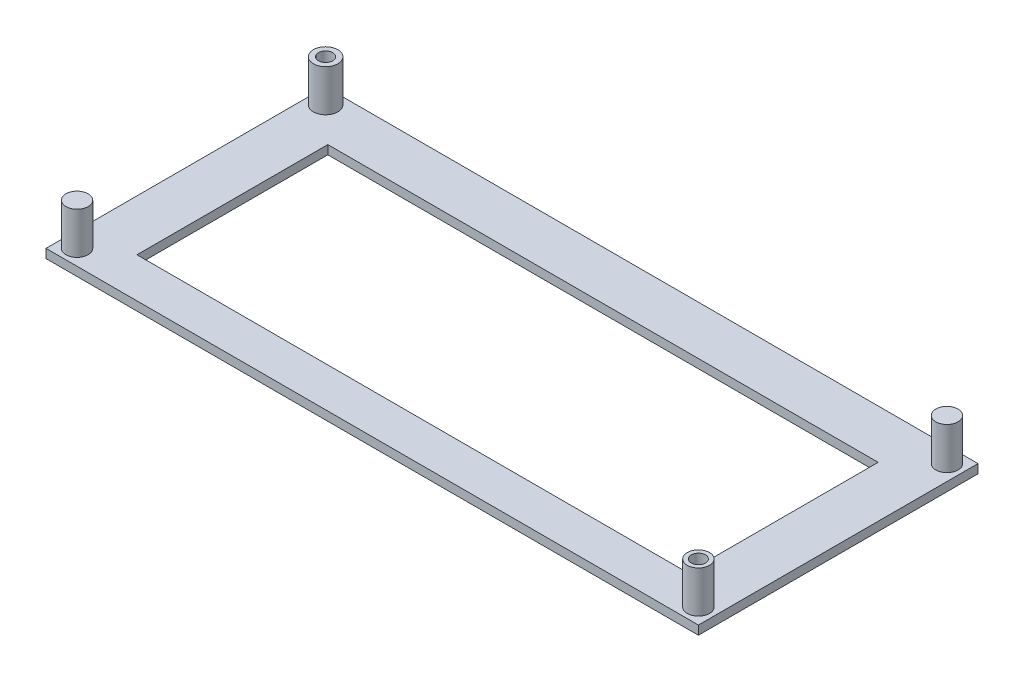
ISO-10303-21;
HEADER;
FILE_DESCRIPTION(('STEP AP214'),'2;1');
FILE_NAME('part.step','',(''),(''),'','','');
FILE_SCHEMA(('AUTOMOTIVE_DESIGN { 1 0 10303 214 1 1 1 1 }'));
ENDSEC;
DATA;
#1=APPLICATION_CONTEXT('core data for automotive mechanical design processes');
#2=APPLICATION_PROTOCOL_DEFINITION('international standard','automotive_design',2000,#1);
#3=PRODUCT_CONTEXT('',#1,'mechanical');
#4=PRODUCT('Part','Part','',(#3));
#5=PRODUCT_RELATED_PRODUCT_CATEGORY('part','',(#4));
#6=PRODUCT_DEFINITION_FORMATION('','',#4);
#7=PRODUCT_DEFINITION_CONTEXT('part definition',#1,'design');
#8=PRODUCT_DEFINITION('design','',#6,#7);
#9=PRODUCT_DEFINITION_SHAPE('','',#8);
#10=(LENGTH_UNIT() NAMED_UNIT(*) SI_UNIT(.MILLI.,.METRE.));
#11=(NAMED_UNIT(*) PLANE_ANGLE_UNIT() SI_UNIT($,.RADIAN.));
#12=(NAMED_UNIT(*) SI_UNIT($,.STERADIAN.) SOLID_ANGLE_UNIT());
#13=UNCERTAINTY_MEASURE_WITH_UNIT(LENGTH_MEASURE(1.E-05),#10,'distance_accuracy_value','');
#14=(GEOMETRIC_REPRESENTATION_CONTEXT(3) GLOBAL_UNCERTAINTY_ASSIGNED_CONTEXT((#13)) GLOBAL_UNIT_ASSIGNED_CONTEXT((#10,
#11,#12)) REPRESENTATION_CONTEXT('',''));
#15=CARTESIAN_POINT('',(0.,0.,0.));
#16=DIRECTION('',(0.,0.,1.));
#17=DIRECTION('',(1.,0.,0.));
#18=AXIS2_PLACEMENT_3D('',#15,#16,#17);
#19=CARTESIAN_POINT('',(0.,2.,-63.));
#20=DIRECTION('',(1.,0.,0.));
#21=DIRECTION('',(0.,0.,-1.));
#22=AXIS2_PLACEMENT_3D('',#19,#20,#21);
#23=PLANE('',#22);
#24=DIRECTION('',(0.,0.,1.));
#25=VECTOR('',#24,1.);
#26=CARTESIAN_POINT('',(0.,0.,-63.));
#27=LINE('',#26,#25);
#28=CARTESIAN_POINT('',(0.,0.,-63.));
#29=VERTEX_POINT('',#28);
#30=CARTESIAN_POINT('',(0.,0.,0.));
#31=VERTEX_POINT('',#30);
#32=EDGE_CURVE('E134',#29,#31,#27,.T.);
#33=ORIENTED_EDGE('',*,*,#32,.T.);
#34=DIRECTION('',(0.,-1.,0.));
#35=VECTOR('',#34,1.);
#36=CARTESIAN_POINT('',(0.,2.,0.));
#37=LINE('',#36,#35);
#38=CARTESIAN_POINT('',(0.,2.,0.));
#39=VERTEX_POINT('',#38);
#40=EDGE_CURVE('E11',#39,#31,#37,.T.);
#41=ORIENTED_EDGE('',*,*,#40,.F.);
#42=DIRECTION('',(0.,0.,1.));
#43=VECTOR('',#42,1.);
#44=CARTESIAN_POINT('',(0.,2.,-63.));
#45=LINE('',#44,#43);
#46=CARTESIAN_POINT('',(0.,2.,-63.));
#47=VERTEX_POINT('',#46);
#48=EDGE_CURVE('E138',#47,#39,#45,.T.);
#49=ORIENTED_EDGE('',*,*,#48,.F.);
#50=DIRECTION('',(0.,-1.,0.));
#51=VECTOR('',#50,1.);
#52=CARTESIAN_POINT('',(0.,2.,-63.));
#53=LINE('',#52,#51);
#54=EDGE_CURVE('E148',#47,#29,#53,.T.);
#55=ORIENTED_EDGE('',*,*,#54,.T.);
#56=EDGE_LOOP('',(#33,#41,#49,#55));
#57=FACE_BOUND('',#56,.T.);
#58=ADVANCED_FACE('F33',(#57),#23,.F.);
#59=CARTESIAN_POINT('',(0.,2.,0.));
#60=DIRECTION('',(0.,0.,-1.));
#61=DIRECTION('',(-1.,0.,0.));
#62=AXIS2_PLACEMENT_3D('',#59,#60,#61);
#63=PLANE('',#62);
#64=DIRECTION('',(1.,0.,0.));
#65=VECTOR('',#64,1.);
#66=CARTESIAN_POINT('',(0.,0.,0.));
#67=LINE('',#66,#65);
#68=CARTESIAN_POINT('',(147.,0.,0.));
#69=VERTEX_POINT('',#68);
#70=EDGE_CURVE('E151',#31,#69,#67,.T.);
#71=ORIENTED_EDGE('',*,*,#70,.T.);
#72=DIRECTION('',(0.,-1.,0.));
#73=VECTOR('',#72,1.);
#74=CARTESIAN_POINT('',(147.,2.,0.));
#75=LINE('',#74,#73);
#76=CARTESIAN_POINT('',(147.,2.,0.));
#77=VERTEX_POINT('',#76);
#78=EDGE_CURVE('E40',#77,#69,#75,.T.);
#79=ORIENTED_EDGE('',*,*,#78,.F.);
#80=DIRECTION('',(1.,0.,0.));
#81=VECTOR('',#80,1.);
#82=CARTESIAN_POINT('',(0.,2.,0.));
#83=LINE('',#82,#81);
#84=EDGE_CURVE('E141',#39,#77,#83,.T.);
#85=ORIENTED_EDGE('',*,*,#84,.F.);
#86=ORIENTED_EDGE('',*,*,#40,.T.);
#87=EDGE_LOOP('',(#71,#79,#85,#86));
#88=FACE_BOUND('',#87,.T.);
#89=ADVANCED_FACE('F179',(#88),#63,.F.);
#90=CARTESIAN_POINT('',(147.,2.,0.));
#91=DIRECTION('',(-1.,0.,0.));
#92=DIRECTION('',(0.,0.,1.));
#93=AXIS2_PLACEMENT_3D('',#90,#91,#92);
#94=PLANE('',#93);
#95=DIRECTION('',(0.,0.,-1.));
#96=VECTOR('',#95,1.);
#97=CARTESIAN_POINT('',(147.,0.,0.));
#98=LINE('',#97,#96);
#99=CARTESIAN_POINT('',(147.,0.,-63.));
#100=VERTEX_POINT('',#99);
#101=EDGE_CURVE('E153',#69,#100,#98,.T.);
#102=ORIENTED_EDGE('',*,*,#101,.T.);
#103=DIRECTION('',(0.,-1.,0.));
#104=VECTOR('',#103,1.);
#105=CARTESIAN_POINT('',(147.,2.,-63.));
#106=LINE('',#105,#104);
#107=CARTESIAN_POINT('',(147.,2.,-63.));
#108=VERTEX_POINT('',#107);
#109=EDGE_CURVE('E158',#108,#100,#106,.T.);
#110=ORIENTED_EDGE('',*,*,#109,.F.);
#111=DIRECTION('',(0.,0.,-1.));
#112=VECTOR('',#111,1.);
#113=CARTESIAN_POINT('',(147.,2.,0.));
#114=LINE('',#113,#112);
#115=EDGE_CURVE('E144',#77,#108,#114,.T.);
#116=ORIENTED_EDGE('',*,*,#115,.F.);
#117=ORIENTED_EDGE('',*,*,#78,.T.);
#118=EDGE_LOOP('',(#102,#110,#116,#117));
#119=FACE_BOUND('',#118,.T.);
#120=ADVANCED_FACE('F165',(#119),#94,.F.);
#121=CARTESIAN_POINT('',(147.,2.,-63.));
#122=DIRECTION('',(0.,0.,1.));
#123=DIRECTION('',(1.,0.,0.));
#124=AXIS2_PLACEMENT_3D('',#121,#122,#123);
#125=PLANE('',#124);
#126=DIRECTION('',(-1.,0.,0.));
#127=VECTOR('',#126,1.);
#128=CARTESIAN_POINT('',(147.,0.,-63.));
#129=LINE('',#128,#127);
#130=EDGE_CURVE('E142',#100,#29,#129,.T.);
#131=ORIENTED_EDGE('',*,*,#130,.T.);
#132=ORIENTED_EDGE('',*,*,#54,.F.);
#133=DIRECTION('',(-1.,0.,0.));
#134=VECTOR('',#133,1.);
#135=CARTESIAN_POINT('',(147.,2.,-63.));
#136=LINE('',#135,#134);
#137=EDGE_CURVE('E146',#108,#47,#136,.T.);
#138=ORIENTED_EDGE('',*,*,#137,.F.);
#139=ORIENTED_EDGE('',*,*,#109,.T.);
#140=EDGE_LOOP('',(#131,#132,#138,#139));
#141=FACE_BOUND('',#140,.T.);
#142=ADVANCED_FACE('F172',(#141),#125,.F.);
#143=CARTESIAN_POINT('',(0.,2.,0.));
#144=DIRECTION('',(0.,1.,0.));
#145=DIRECTION('',(0.,0.,1.));
#146=AXIS2_PLACEMENT_3D('',#143,#144,#145);
#147=PLANE('',#146);
#148=CARTESIAN_POINT('',(3.5,2.,-3.5));
#149=DIRECTION('',(0.,1.,0.));
#150=DIRECTION('',(0.,0.,1.));
#151=AXIS2_PLACEMENT_3D('',#148,#149,#150);
#152=CIRCLE('',#151,2.5);
#153=CARTESIAN_POINT('',(3.5,2.,-1.));
#154=VERTEX_POINT('',#153);
#155=EDGE_CURVE('E251',#154,#154,#152,.T.);
#156=ORIENTED_EDGE('',*,*,#155,.F.);
#157=EDGE_LOOP('',(#156));
#158=FACE_BOUND('',#157,.T.);
#159=CARTESIAN_POINT('',(143.5,2.,-59.5));
#160=DIRECTION('',(0.,1.,0.));
#161=DIRECTION('',(0.,0.,1.));
#162=AXIS2_PLACEMENT_3D('',#159,#160,#161);
#163=CIRCLE('',#162,2.5);
#164=CARTESIAN_POINT('',(143.5,2.,-57.));
#165=VERTEX_POINT('',#164);
#166=EDGE_CURVE('E250',#165,#165,#163,.T.);
#167=ORIENTED_EDGE('',*,*,#166,.F.);
#168=EDGE_LOOP('',(#167));
#169=FACE_BOUND('',#168,.T.);
#170=CARTESIAN_POINT('',(143.5,2.,-3.5));
#171=DIRECTION('',(0.,1.,0.));
#172=DIRECTION('',(0.,0.,1.));
#173=AXIS2_PLACEMENT_3D('',#170,#171,#172);
#174=CIRCLE('',#173,2.5);
#175=CARTESIAN_POINT('',(143.5,2.,-1.));
#176=VERTEX_POINT('',#175);
#177=EDGE_CURVE('E265',#176,#176,#174,.T.);
#178=ORIENTED_EDGE('',*,*,#177,.F.);
#179=EDGE_LOOP('',(#178));
#180=FACE_BOUND('',#179,.T.);
#181=CARTESIAN_POINT('',(3.5,2.,-59.5));
#182=DIRECTION('',(0.,1.,0.));
#183=DIRECTION('',(0.,0.,1.));
#184=AXIS2_PLACEMENT_3D('',#181,#182,#183);
#185=CIRCLE('',#184,2.75237869564838);
#186=CARTESIAN_POINT('',(3.5,2.,-56.7476213043516));
#187=VERTEX_POINT('',#186);
#188=EDGE_CURVE('E121',#187,#187,#185,.T.);
#189=ORIENTED_EDGE('',*,*,#188,.F.);
#190=EDGE_LOOP('',(#189));
#191=FACE_BOUND('',#190,.T.);
#192=DIRECTION('',(-1.,0.,0.));
#193=VECTOR('',#192,1.);
#194=CARTESIAN_POINT('',(135.5,2.,-52.));
#195=LINE('',#194,#193);
#196=CARTESIAN_POINT('',(135.5,2.,-52.));
#197=VERTEX_POINT('',#196);
#198=CARTESIAN_POINT('',(11.5,2.,-52.));
#199=VERTEX_POINT('',#198);
#200=EDGE_CURVE('E47',#197,#199,#195,.T.);
#201=ORIENTED_EDGE('',*,*,#200,.F.);
#202=DIRECTION('',(0.,0.,-1.));
#203=VECTOR('',#202,1.);
#204=CARTESIAN_POINT('',(135.5,2.,-9.));
#205=LINE('',#204,#203);
#206=CARTESIAN_POINT('',(135.5,2.,-9.));
#207=VERTEX_POINT('',#206);
#208=EDGE_CURVE('E115',#207,#197,#205,.T.);
#209=ORIENTED_EDGE('',*,*,#208,.F.);
#210=DIRECTION('',(1.,0.,0.));
#211=VECTOR('',#210,1.);
#212=CARTESIAN_POINT('',(11.5,2.,-9.));
#213=LINE('',#212,#211);
#214=CARTESIAN_POINT('',(11.5,2.,-9.));
#215=VERTEX_POINT('',#214);
#216=EDGE_CURVE('E118',#215,#207,#213,.T.);
#217=ORIENTED_EDGE('',*,*,#216,.F.);
#218=DIRECTION('',(0.,0.,1.));
#219=VECTOR('',#218,1.);
#220=CARTESIAN_POINT('',(11.5,2.,-52.));
#221=LINE('',#220,#219);
#222=EDGE_CURVE('E127',#199,#215,#221,.T.);
#223=ORIENTED_EDGE('',*,*,#222,.F.);
#224=EDGE_LOOP('',(#201,#209,#217,#223));
#225=FACE_BOUND('',#224,.T.);
#226=ORIENTED_EDGE('',*,*,#48,.T.);
#227=ORIENTED_EDGE('',*,*,#84,.T.);
#228=ORIENTED_EDGE('',*,*,#115,.T.);
#229=ORIENTED_EDGE('',*,*,#137,.T.);
#230=EDGE_LOOP('',(#226,#227,#228,#229));
#231=FACE_BOUND('',#230,.T.);
#232=ADVANCED_FACE('F178',(#158,#169,#180,#191,#225,#231),#147,.T.);
#233=CARTESIAN_POINT('',(0.,0.,0.));
#234=DIRECTION('',(0.,1.,0.));
#235=DIRECTION('',(0.,0.,1.));
#236=AXIS2_PLACEMENT_3D('',#233,#234,#235);
#237=PLANE('',#236);
#238=CARTESIAN_POINT('',(143.5,0.,-3.5));
#239=DIRECTION('',(0.,1.,0.));
#240=DIRECTION('',(0.,0.,1.));
#241=AXIS2_PLACEMENT_3D('',#238,#239,#240);
#242=CIRCLE('',#241,1.59999999999999);
#243=CARTESIAN_POINT('',(143.5,0.,-1.90000000000001));
#244=VERTEX_POINT('',#243);
#245=EDGE_CURVE('E262',#244,#244,#242,.T.);
#246=ORIENTED_EDGE('',*,*,#245,.T.);
#247=EDGE_LOOP('',(#246));
#248=FACE_BOUND('',#247,.T.);
#249=CARTESIAN_POINT('',(3.5,0.,-59.5));
#250=DIRECTION('',(0.,1.,0.));
#251=DIRECTION('',(0.,0.,1.));
#252=AXIS2_PLACEMENT_3D('',#249,#250,#251);
#253=CIRCLE('',#252,1.6);
#254=CARTESIAN_POINT('',(3.5,0.,-57.9));
#255=VERTEX_POINT('',#254);
#256=EDGE_CURVE('E274',#255,#255,#253,.T.);
#257=ORIENTED_EDGE('',*,*,#256,.T.);
#258=EDGE_LOOP('',(#257));
#259=FACE_BOUND('',#258,.T.);
#260=DIRECTION('',(0.,0.,-1.));
#261=VECTOR('',#260,1.);
#262=CARTESIAN_POINT('',(135.5,0.,-9.));
#263=LINE('',#262,#261);
#264=CARTESIAN_POINT('',(135.5,0.,-9.));
#265=VERTEX_POINT('',#264);
#266=CARTESIAN_POINT('',(135.5,0.,-52.));
#267=VERTEX_POINT('',#266);
#268=EDGE_CURVE('E105',#265,#267,#263,.T.);
#269=ORIENTED_EDGE('',*,*,#268,.T.);
#270=DIRECTION('',(-1.,0.,0.));
#271=VECTOR('',#270,1.);
#272=CARTESIAN_POINT('',(135.5,0.,-52.));
#273=LINE('',#272,#271);
#274=CARTESIAN_POINT('',(11.5,0.,-52.));
#275=VERTEX_POINT('',#274);
#276=EDGE_CURVE('E99',#267,#275,#273,.T.);
#277=ORIENTED_EDGE('',*,*,#276,.T.);
#278=DIRECTION('',(0.,0.,1.));
#279=VECTOR('',#278,1.);
#280=CARTESIAN_POINT('',(11.5,0.,-52.));
#281=LINE('',#280,#279);
#282=CARTESIAN_POINT('',(11.5,0.,-9.));
#283=VERTEX_POINT('',#282);
#284=EDGE_CURVE('E108',#275,#283,#281,.T.);
#285=ORIENTED_EDGE('',*,*,#284,.T.);
#286=DIRECTION('',(1.,0.,0.));
#287=VECTOR('',#286,1.);
#288=CARTESIAN_POINT('',(11.5,0.,-9.));
#289=LINE('',#288,#287);
#290=EDGE_CURVE('E55',#283,#265,#289,.T.);
#291=ORIENTED_EDGE('',*,*,#290,.T.);
#292=EDGE_LOOP('',(#269,#277,#285,#291));
#293=FACE_BOUND('',#292,.T.);
#294=ORIENTED_EDGE('',*,*,#32,.F.);
#295=ORIENTED_EDGE('',*,*,#130,.F.);
#296=ORIENTED_EDGE('',*,*,#101,.F.);
#297=ORIENTED_EDGE('',*,*,#70,.F.);
#298=EDGE_LOOP('',(#294,#295,#296,#297));
#299=FACE_BOUND('',#298,.T.);
#300=ADVANCED_FACE('F112',(#248,#259,#293,#299),#237,.F.);
#301=CARTESIAN_POINT('',(135.5,0.,-52.));
#302=DIRECTION('',(0.,0.,-1.));
#303=DIRECTION('',(-1.,0.,0.));
#304=AXIS2_PLACEMENT_3D('',#301,#302,#303);
#305=PLANE('',#304);
#306=ORIENTED_EDGE('',*,*,#200,.T.);
#307=DIRECTION('',(0.,1.,0.));
#308=VECTOR('',#307,1.);
#309=CARTESIAN_POINT('',(11.5,0.,-52.));
#310=LINE('',#309,#308);
#311=EDGE_CURVE('E95',#275,#199,#310,.T.);
#312=ORIENTED_EDGE('',*,*,#311,.F.);
#313=ORIENTED_EDGE('',*,*,#276,.F.);
#314=DIRECTION('',(0.,1.,0.));
#315=VECTOR('',#314,1.);
#316=CARTESIAN_POINT('',(135.5,0.,-52.));
#317=LINE('',#316,#315);
#318=EDGE_CURVE('E132',#267,#197,#317,.T.);
#319=ORIENTED_EDGE('',*,*,#318,.T.);
#320=EDGE_LOOP('',(#306,#312,#313,#319));
#321=FACE_BOUND('',#320,.T.);
#322=ADVANCED_FACE('F97',(#321),#305,.F.);
#323=CARTESIAN_POINT('',(135.5,0.,-9.));
#324=DIRECTION('',(1.,0.,0.));
#325=DIRECTION('',(0.,0.,-1.));
#326=AXIS2_PLACEMENT_3D('',#323,#324,#325);
#327=PLANE('',#326);
#328=ORIENTED_EDGE('',*,*,#208,.T.);
#329=ORIENTED_EDGE('',*,*,#318,.F.);
#330=ORIENTED_EDGE('',*,*,#268,.F.);
#331=DIRECTION('',(0.,1.,0.));
#332=VECTOR('',#331,1.);
#333=CARTESIAN_POINT('',(135.5,0.,-9.));
#334=LINE('',#333,#332);
#335=EDGE_CURVE('E135',#265,#207,#334,.T.);
#336=ORIENTED_EDGE('',*,*,#335,.T.);
#337=EDGE_LOOP('',(#328,#329,#330,#336));
#338=FACE_BOUND('',#337,.T.);
#339=ADVANCED_FACE('F197',(#338),#327,.F.);
#340=CARTESIAN_POINT('',(11.5,0.,-9.));
#341=DIRECTION('',(0.,0.,1.));
#342=DIRECTION('',(1.,0.,0.));
#343=AXIS2_PLACEMENT_3D('',#340,#341,#342);
#344=PLANE('',#343);
#345=ORIENTED_EDGE('',*,*,#216,.T.);
#346=ORIENTED_EDGE('',*,*,#335,.F.);
#347=ORIENTED_EDGE('',*,*,#290,.F.);
#348=DIRECTION('',(0.,1.,0.));
#349=VECTOR('',#348,1.);
#350=CARTESIAN_POINT('',(11.5,0.,-9.));
#351=LINE('',#350,#349);
#352=EDGE_CURVE('E104',#283,#215,#351,.T.);
#353=ORIENTED_EDGE('',*,*,#352,.T.);
#354=EDGE_LOOP('',(#345,#346,#347,#353));
#355=FACE_BOUND('',#354,.T.);
#356=ADVANCED_FACE('F201',(#355),#344,.F.);
#357=CARTESIAN_POINT('',(11.5,0.,-52.));
#358=DIRECTION('',(-1.,0.,0.));
#359=DIRECTION('',(0.,0.,1.));
#360=AXIS2_PLACEMENT_3D('',#357,#358,#359);
#361=PLANE('',#360);
#362=ORIENTED_EDGE('',*,*,#222,.T.);
#363=ORIENTED_EDGE('',*,*,#352,.F.);
#364=ORIENTED_EDGE('',*,*,#284,.F.);
#365=ORIENTED_EDGE('',*,*,#311,.T.);
#366=EDGE_LOOP('',(#362,#363,#364,#365));
#367=FACE_BOUND('',#366,.T.);
#368=ADVANCED_FACE('F109',(#367),#361,.F.);
#369=CARTESIAN_POINT('',(3.5,11.4,-59.5));
#370=DIRECTION('',(0.,-1.,0.));
#371=DIRECTION('',(0.,0.,-1.));
#372=AXIS2_PLACEMENT_3D('',#369,#370,#371);
#373=CYLINDRICAL_SURFACE('',#372,2.75237869564838);
#374=CARTESIAN_POINT('',(3.5,11.4,-59.5));
#375=DIRECTION('',(0.,1.,0.));
#376=DIRECTION('',(0.,0.,1.));
#377=AXIS2_PLACEMENT_3D('',#374,#375,#376);
#378=CIRCLE('',#377,2.75237869564838);
#379=CARTESIAN_POINT('',(3.5,11.4,-56.7476213043516));
#380=VERTEX_POINT('',#379);
#381=EDGE_CURVE('E128',#380,#380,#378,.T.);
#382=ORIENTED_EDGE('',*,*,#381,.F.);
#383=EDGE_LOOP('',(#382));
#384=FACE_BOUND('',#383,.T.);
#385=ORIENTED_EDGE('',*,*,#188,.T.);
#386=EDGE_LOOP('',(#385));
#387=FACE_BOUND('',#386,.T.);
#388=ADVANCED_FACE('F200',(#384,#387),#373,.T.);
#389=CARTESIAN_POINT('',(3.5,11.4,-59.5));
#390=DIRECTION('',(0.,1.,0.));
#391=DIRECTION('',(0.,0.,1.));
#392=AXIS2_PLACEMENT_3D('',#389,#390,#391);
#393=PLANE('',#392);
#394=CARTESIAN_POINT('',(3.5,11.4,-59.5));
#395=DIRECTION('',(0.,1.,0.));
#396=DIRECTION('',(0.,0.,1.));
#397=AXIS2_PLACEMENT_3D('',#394,#395,#396);
#398=CIRCLE('',#397,1.6);
#399=CARTESIAN_POINT('',(3.5,11.4,-57.9));
#400=VERTEX_POINT('',#399);
#401=EDGE_CURVE('E271',#400,#400,#398,.T.);
#402=ORIENTED_EDGE('',*,*,#401,.F.);
#403=EDGE_LOOP('',(#402));
#404=FACE_BOUND('',#403,.T.);
#405=ORIENTED_EDGE('',*,*,#381,.T.);
#406=EDGE_LOOP('',(#405));
#407=FACE_BOUND('',#406,.T.);
#408=ADVANCED_FACE('F209',(#404,#407),#393,.T.);
#409=CARTESIAN_POINT('',(3.5,0.,-59.5));
#410=DIRECTION('',(0.,1.,0.));
#411=DIRECTION('',(0.,0.,1.));
#412=AXIS2_PLACEMENT_3D('',#409,#410,#411);
#413=CYLINDRICAL_SURFACE('',#412,1.6);
#414=ORIENTED_EDGE('',*,*,#256,.F.);
#415=EDGE_LOOP('',(#414));
#416=FACE_BOUND('',#415,.T.);
#417=ORIENTED_EDGE('',*,*,#401,.T.);
#418=EDGE_LOOP('',(#417));
#419=FACE_BOUND('',#418,.T.);
#420=ADVANCED_FACE('F213',(#416,#419),#413,.F.);
#421=CARTESIAN_POINT('',(143.5,11.4,-3.5));
#422=DIRECTION('',(0.,-1.,0.));
#423=DIRECTION('',(0.,0.,-1.));
#424=AXIS2_PLACEMENT_3D('',#421,#422,#423);
#425=CYLINDRICAL_SURFACE('',#424,2.5);
#426=CARTESIAN_POINT('',(143.5,11.4,-3.5));
#427=DIRECTION('',(0.,1.,0.));
#428=DIRECTION('',(0.,0.,1.));
#429=AXIS2_PLACEMENT_3D('',#426,#427,#428);
#430=CIRCLE('',#429,2.5);
#431=CARTESIAN_POINT('',(143.5,11.4,-1.));
#432=VERTEX_POINT('',#431);
#433=EDGE_CURVE('E268',#432,#432,#430,.T.);
#434=ORIENTED_EDGE('',*,*,#433,.F.);
#435=EDGE_LOOP('',(#434));
#436=FACE_BOUND('',#435,.T.);
#437=ORIENTED_EDGE('',*,*,#177,.T.);
#438=EDGE_LOOP('',(#437));
#439=FACE_BOUND('',#438,.T.);
#440=ADVANCED_FACE('F217',(#436,#439),#425,.T.);
#441=CARTESIAN_POINT('',(143.5,11.4,-3.5));
#442=DIRECTION('',(0.,1.,0.));
#443=DIRECTION('',(0.,0.,1.));
#444=AXIS2_PLACEMENT_3D('',#441,#442,#443);
#445=PLANE('',#444);
#446=CARTESIAN_POINT('',(143.5,11.4,-3.5));
#447=DIRECTION('',(0.,1.,0.));
#448=DIRECTION('',(0.,0.,1.));
#449=AXIS2_PLACEMENT_3D('',#446,#447,#448);
#450=CIRCLE('',#449,1.59999999999999);
#451=CARTESIAN_POINT('',(143.5,11.4,-1.90000000000001));
#452=VERTEX_POINT('',#451);
#453=EDGE_CURVE('E260',#452,#452,#450,.T.);
#454=ORIENTED_EDGE('',*,*,#453,.F.);
#455=EDGE_LOOP('',(#454));
#456=FACE_BOUND('',#455,.T.);
#457=ORIENTED_EDGE('',*,*,#433,.T.);
#458=EDGE_LOOP('',(#457));
#459=FACE_BOUND('',#458,.T.);
#460=ADVANCED_FACE('F221',(#456,#459),#445,.T.);
#461=CARTESIAN_POINT('',(143.5,0.,-3.5));
#462=DIRECTION('',(0.,1.,0.));
#463=DIRECTION('',(0.,0.,1.));
#464=AXIS2_PLACEMENT_3D('',#461,#462,#463);
#465=CYLINDRICAL_SURFACE('',#464,1.59999999999999);
#466=ORIENTED_EDGE('',*,*,#245,.F.);
#467=EDGE_LOOP('',(#466));
#468=FACE_BOUND('',#467,.T.);
#469=ORIENTED_EDGE('',*,*,#453,.T.);
#470=EDGE_LOOP('',(#469));
#471=FACE_BOUND('',#470,.T.);
#472=ADVANCED_FACE('F225',(#468,#471),#465,.F.);
#473=CARTESIAN_POINT('',(143.5,11.4,-59.5));
#474=DIRECTION('',(0.,-1.,0.));
#475=DIRECTION('',(0.,0.,-1.));
#476=AXIS2_PLACEMENT_3D('',#473,#474,#475);
#477=CYLINDRICAL_SURFACE('',#476,2.5);
#478=CARTESIAN_POINT('',(143.5,11.4,-59.5));
#479=DIRECTION('',(0.,1.,0.));
#480=DIRECTION('',(0.,0.,1.));
#481=AXIS2_PLACEMENT_3D('',#478,#479,#480);
#482=CIRCLE('',#481,2.5);
#483=CARTESIAN_POINT('',(143.5,11.4,-57.));
#484=VERTEX_POINT('',#483);
#485=EDGE_CURVE('E254',#484,#484,#482,.T.);
#486=ORIENTED_EDGE('',*,*,#485,.F.);
#487=EDGE_LOOP('',(#486));
#488=FACE_BOUND('',#487,.T.);
#489=ORIENTED_EDGE('',*,*,#166,.T.);
#490=EDGE_LOOP('',(#489));
#491=FACE_BOUND('',#490,.T.);
#492=ADVANCED_FACE('F229',(#488,#491),#477,.T.);
#493=CARTESIAN_POINT('',(143.5,11.4,-59.5));
#494=DIRECTION('',(0.,1.,0.));
#495=DIRECTION('',(0.,0.,1.));
#496=AXIS2_PLACEMENT_3D('',#493,#494,#495);
#497=PLANE('',#496);
#498=ORIENTED_EDGE('',*,*,#485,.T.);
#499=EDGE_LOOP('',(#498));
#500=FACE_BOUND('',#499,.T.);
#501=ADVANCED_FACE('F233',(#500),#497,.T.);
#502=CARTESIAN_POINT('',(3.5,11.4,-3.5));
#503=DIRECTION('',(0.,-1.,0.));
#504=DIRECTION('',(0.,0.,-1.));
#505=AXIS2_PLACEMENT_3D('',#502,#503,#504);
#506=CYLINDRICAL_SURFACE('',#505,2.5);
#507=CARTESIAN_POINT('',(3.5,11.4,-3.5));
#508=DIRECTION('',(0.,1.,0.));
#509=DIRECTION('',(0.,0.,1.));
#510=AXIS2_PLACEMENT_3D('',#507,#508,#509);
#511=CIRCLE('',#510,2.5);
#512=CARTESIAN_POINT('',(3.5,11.4,-1.));
#513=VERTEX_POINT('',#512);
#514=EDGE_CURVE('E249',#513,#513,#511,.T.);
#515=ORIENTED_EDGE('',*,*,#514,.F.);
#516=EDGE_LOOP('',(#515));
#517=FACE_BOUND('',#516,.T.);
#518=ORIENTED_EDGE('',*,*,#155,.T.);
#519=EDGE_LOOP('',(#518));
#520=FACE_BOUND('',#519,.T.);
#521=ADVANCED_FACE('F237',(#517,#520),#506,.T.);
#522=CARTESIAN_POINT('',(3.5,11.4,-3.5));
#523=DIRECTION('',(0.,1.,0.));
#524=DIRECTION('',(0.,0.,1.));
#525=AXIS2_PLACEMENT_3D('',#522,#523,#524);
#526=PLANE('',#525);
#527=ORIENTED_EDGE('',*,*,#514,.T.);
#528=EDGE_LOOP('',(#527));
#529=FACE_BOUND('',#528,.T.);
#530=ADVANCED_FACE('F241',(#529),#526,.T.);
#531=CLOSED_SHELL('',(#58,#89,#120,#142,#232,#300,#322,#339,#356,#368,#388,#408,#420,#440,#460,
#472,#492,#501,#521,#530));
#532=MANIFOLD_SOLID_BREP('B2',#531);
#533=ADVANCED_BREP_SHAPE_REPRESENTATION('',(#18,#532),#14);
#534=SHAPE_DEFINITION_REPRESENTATION(#9,#533);
ENDSEC;
END-ISO-10303-21;
